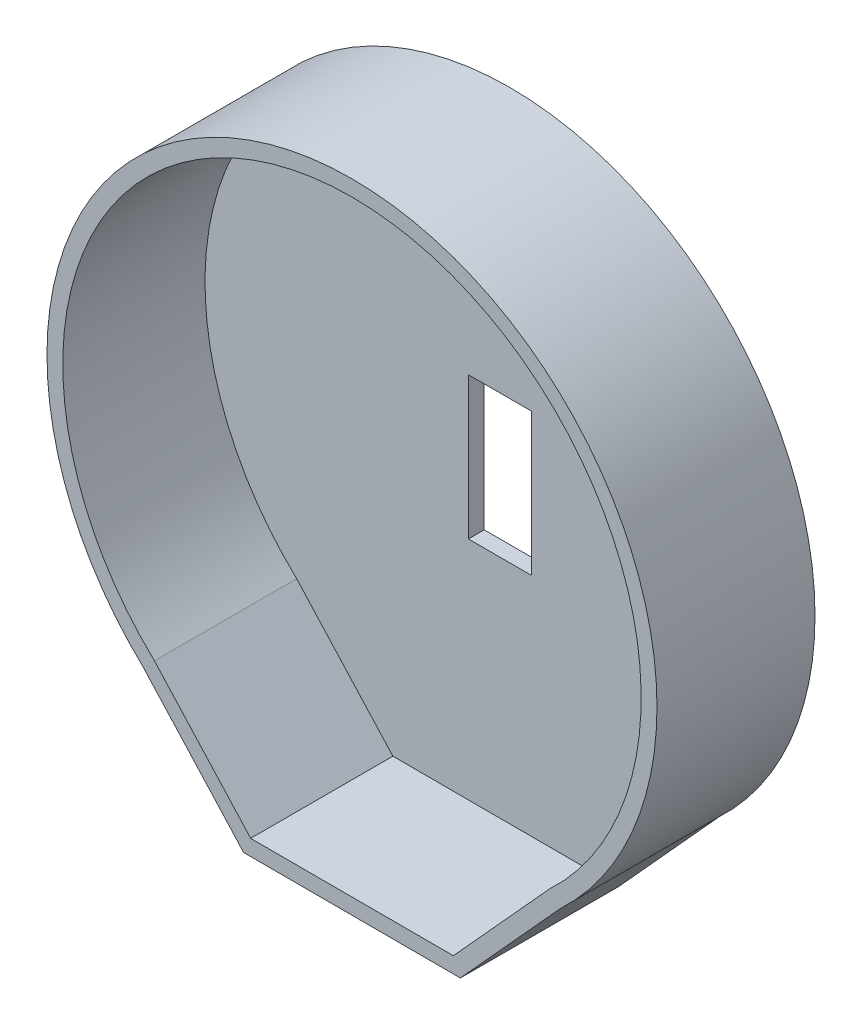
ISO-10303-21;
HEADER;
FILE_DESCRIPTION(('STEP AP214'),'2;1');
FILE_NAME('part.step','',(''),(''),'','','');
FILE_SCHEMA(('AUTOMOTIVE_DESIGN { 1 0 10303 214 1 1 1 1 }'));
ENDSEC;
DATA;
#1=APPLICATION_CONTEXT('core data for automotive mechanical design processes');
#2=APPLICATION_PROTOCOL_DEFINITION('international standard','automotive_design',2000,#1);
#3=PRODUCT_CONTEXT('',#1,'mechanical');
#4=PRODUCT('Part','Part','',(#3));
#5=PRODUCT_RELATED_PRODUCT_CATEGORY('part','',(#4));
#6=PRODUCT_DEFINITION_FORMATION('','',#4);
#7=PRODUCT_DEFINITION_CONTEXT('part definition',#1,'design');
#8=PRODUCT_DEFINITION('design','',#6,#7);
#9=PRODUCT_DEFINITION_SHAPE('','',#8);
#10=(LENGTH_UNIT() NAMED_UNIT(*) SI_UNIT(.MILLI.,.METRE.));
#11=(NAMED_UNIT(*) PLANE_ANGLE_UNIT() SI_UNIT($,.RADIAN.));
#12=(NAMED_UNIT(*) SI_UNIT($,.STERADIAN.) SOLID_ANGLE_UNIT());
#13=UNCERTAINTY_MEASURE_WITH_UNIT(LENGTH_MEASURE(1.E-05),#10,'distance_accuracy_value','');
#14=(GEOMETRIC_REPRESENTATION_CONTEXT(3) GLOBAL_UNCERTAINTY_ASSIGNED_CONTEXT((#13)) GLOBAL_UNIT_ASSIGNED_CONTEXT((#10,
#11,#12)) REPRESENTATION_CONTEXT('',''));
#15=CARTESIAN_POINT('',(0.,0.,0.));
#16=DIRECTION('',(0.,0.,1.));
#17=DIRECTION('',(1.,0.,0.));
#18=AXIS2_PLACEMENT_3D('',#15,#16,#17);
#19=CARTESIAN_POINT('',(-3.59774024797865,-21.8435557966853,10.));
#20=DIRECTION('',(-0.740412562536273,0.672152688931964,0.));
#21=DIRECTION('',(-0.672152688931964,-0.740412562536273,0.));
#22=AXIS2_PLACEMENT_3D('',#19,#20,#21);
#23=PLANE('',#22);
#24=DIRECTION('',(0.672152688931964,0.740412562536273,0.));
#25=VECTOR('',#24,1.);
#26=CARTESIAN_POINT('',(-3.59774024797865,-21.8435557966853,0.));
#27=LINE('',#26,#25);
#28=CARTESIAN_POINT('',(-3.59774024797865,-21.8435557966853,0.));
#29=VERTEX_POINT('',#28);
#30=CARTESIAN_POINT('',(2.75790810704578,-14.8424651775278,0.));
#31=VERTEX_POINT('',#30);
#32=EDGE_CURVE('E188',#29,#31,#27,.T.);
#33=ORIENTED_EDGE('',*,*,#32,.T.);
#34=DIRECTION('',(0.,0.,-1.));
#35=VECTOR('',#34,1.);
#36=CARTESIAN_POINT('',(2.75790810704578,-14.8424651775278,10.));
#37=LINE('',#36,#35);
#38=CARTESIAN_POINT('',(2.75790810704578,-14.8424651775278,10.));
#39=VERTEX_POINT('',#38);
#40=EDGE_CURVE('E11',#39,#31,#37,.T.);
#41=ORIENTED_EDGE('',*,*,#40,.F.);
#42=DIRECTION('',(0.672152688931964,0.740412562536273,0.));
#43=VECTOR('',#42,1.);
#44=CARTESIAN_POINT('',(-3.59774024797865,-21.8435557966853,10.));
#45=LINE('',#44,#43);
#46=CARTESIAN_POINT('',(-3.59774024797865,-21.8435557966853,10.));
#47=VERTEX_POINT('',#46);
#48=EDGE_CURVE('E222',#47,#39,#45,.T.);
#49=ORIENTED_EDGE('',*,*,#48,.F.);
#50=DIRECTION('',(0.,0.,-1.));
#51=VECTOR('',#50,1.);
#52=CARTESIAN_POINT('',(-3.59774024797865,-21.8435557966853,10.));
#53=LINE('',#52,#51);
#54=EDGE_CURVE('E237',#47,#29,#53,.T.);
#55=ORIENTED_EDGE('',*,*,#54,.T.);
#56=EDGE_LOOP('',(#33,#41,#49,#55));
#57=FACE_BOUND('',#56,.T.);
#58=ADVANCED_FACE('F43',(#57),#23,.F.);
#59=CARTESIAN_POINT('',(-10.4551158286561,-0.774558493355795,10.));
#60=DIRECTION('',(0.,0.,-1.));
#61=DIRECTION('',(-1.,0.,0.));
#62=AXIS2_PLACEMENT_3D('',#59,#60,#61);
#63=CYLINDRICAL_SURFACE('',#62,19.3);
#64=CARTESIAN_POINT('',(-10.4551158286561,-0.774558493355795,0.));
#65=DIRECTION('',(0.,0.,1.));
#66=DIRECTION('',(1.,0.,0.));
#67=AXIS2_PLACEMENT_3D('',#64,#65,#66);
#68=CIRCLE('',#67,19.3);
#69=CARTESIAN_POINT('',(-23.6681397643578,-14.8424651775278,0.));
#70=VERTEX_POINT('',#69);
#71=EDGE_CURVE('E241',#31,#70,#68,.T.);
#72=ORIENTED_EDGE('',*,*,#71,.T.);
#73=DIRECTION('',(0.,0.,-1.));
#74=VECTOR('',#73,1.);
#75=CARTESIAN_POINT('',(-23.6681397643578,-14.8424651775278,10.));
#76=LINE('',#75,#74);
#77=CARTESIAN_POINT('',(-23.6681397643578,-14.8424651775278,10.));
#78=VERTEX_POINT('',#77);
#79=EDGE_CURVE('E51',#78,#70,#76,.T.);
#80=ORIENTED_EDGE('',*,*,#79,.F.);
#81=CARTESIAN_POINT('',(-10.4551158286561,-0.774558493355795,10.));
#82=DIRECTION('',(0.,0.,1.));
#83=DIRECTION('',(1.,0.,0.));
#84=AXIS2_PLACEMENT_3D('',#81,#82,#83);
#85=CIRCLE('',#84,19.3);
#86=EDGE_CURVE('E226',#39,#78,#85,.T.);
#87=ORIENTED_EDGE('',*,*,#86,.F.);
#88=ORIENTED_EDGE('',*,*,#40,.T.);
#89=EDGE_LOOP('',(#72,#80,#87,#88));
#90=FACE_BOUND('',#89,.T.);
#91=ADVANCED_FACE('F263',(#90),#63,.T.);
#92=CARTESIAN_POINT('',(-17.3105207108081,-21.8238893763412,10.));
#93=DIRECTION('',(-0.739366827981317,-0.673302824649389,0.));
#94=DIRECTION('',(0.673302824649389,-0.739366827981317,0.));
#95=AXIS2_PLACEMENT_3D('',#92,#93,#94);
#96=PLANE('',#95);
#97=DIRECTION('',(-0.673302824649389,0.739366827981317,0.));
#98=VECTOR('',#97,1.);
#99=CARTESIAN_POINT('',(-17.3105207108081,-21.8238893763412,0.));
#100=LINE('',#99,#98);
#101=CARTESIAN_POINT('',(-17.3105207108081,-21.8238893763412,0.));
#102=VERTEX_POINT('',#101);
#103=EDGE_CURVE('E245',#102,#70,#100,.T.);
#104=ORIENTED_EDGE('',*,*,#103,.F.);
#105=DIRECTION('',(0.,0.,-1.));
#106=VECTOR('',#105,1.);
#107=CARTESIAN_POINT('',(-17.3105207108081,-21.8238893763412,10.));
#108=LINE('',#107,#106);
#109=CARTESIAN_POINT('',(-17.3105207108081,-21.8238893763412,10.));
#110=VERTEX_POINT('',#109);
#111=EDGE_CURVE('E254',#110,#102,#108,.T.);
#112=ORIENTED_EDGE('',*,*,#111,.F.);
#113=DIRECTION('',(-0.673302824649389,0.739366827981317,0.));
#114=VECTOR('',#113,1.);
#115=CARTESIAN_POINT('',(-17.3105207108081,-21.8238893763412,10.));
#116=LINE('',#115,#114);
#117=EDGE_CURVE('E230',#110,#78,#116,.T.);
#118=ORIENTED_EDGE('',*,*,#117,.T.);
#119=ORIENTED_EDGE('',*,*,#79,.T.);
#120=EDGE_LOOP('',(#104,#112,#118,#119));
#121=FACE_BOUND('',#120,.T.);
#122=ADVANCED_FACE('F260',(#121),#96,.T.);
#123=CARTESIAN_POINT('',(-17.3105207108081,-21.8238893763412,10.));
#124=DIRECTION('',(0.00143416575304298,0.999998971583768,0.));
#125=DIRECTION('',(-0.999998971583768,0.00143416575304298,0.));
#126=AXIS2_PLACEMENT_3D('',#123,#124,#125);
#127=PLANE('',#126);
#128=DIRECTION('',(0.999998971583767,-0.00143416575304298,0.));
#129=VECTOR('',#128,1.);
#130=CARTESIAN_POINT('',(-17.3105207108081,-21.8238893763412,0.));
#131=LINE('',#130,#129);
#132=EDGE_CURVE('E227',#102,#29,#131,.T.);
#133=ORIENTED_EDGE('',*,*,#132,.T.);
#134=ORIENTED_EDGE('',*,*,#54,.F.);
#135=DIRECTION('',(0.999998971583767,-0.00143416575304298,0.));
#136=VECTOR('',#135,1.);
#137=CARTESIAN_POINT('',(-17.3105207108081,-21.8238893763412,10.));
#138=LINE('',#137,#136);
#139=EDGE_CURVE('E234',#110,#47,#138,.T.);
#140=ORIENTED_EDGE('',*,*,#139,.F.);
#141=ORIENTED_EDGE('',*,*,#111,.T.);
#142=EDGE_LOOP('',(#133,#134,#140,#141));
#143=FACE_BOUND('',#142,.T.);
#144=ADVANCED_FACE('F271',(#143),#127,.F.);
#145=CARTESIAN_POINT('',(-10.4551158286561,-0.774558493355795,10.));
#146=DIRECTION('',(0.,0.,1.));
#147=DIRECTION('',(1.,0.,0.));
#148=AXIS2_PLACEMENT_3D('',#145,#146,#147);
#149=PLANE('',#148);
#150=DIRECTION('',(0.672152688931964,0.740412562536273,0.));
#151=VECTOR('',#150,1.);
#152=CARTESIAN_POINT('',(-4.33815281051492,-21.1714031077533,10.));
#153=LINE('',#152,#151);
#154=CARTESIAN_POINT('',(-4.03995361903653,-20.8429205603435,10.));
#155=VERTEX_POINT('',#154);
#156=CARTESIAN_POINT('',(2.04462195345001,-14.140431281116,10.));
#157=VERTEX_POINT('',#156);
#158=EDGE_CURVE('E210',#155,#157,#153,.T.);
#159=ORIENTED_EDGE('',*,*,#158,.F.);
#160=DIRECTION('',(0.999998971583768,-0.00143416575304298,0.));
#161=VECTOR('',#160,1.);
#162=CARTESIAN_POINT('',(-17.309086545055,-20.8238904047575,10.));
#163=LINE('',#162,#161);
#164=CARTESIAN_POINT('',(-16.8680830721684,-20.8245228774857,10.));
#165=VERTEX_POINT('',#164);
#166=EDGE_CURVE('E195',#165,#155,#163,.T.);
#167=ORIENTED_EDGE('',*,*,#166,.F.);
#168=DIRECTION('',(-0.673302824649389,0.739366827981317,0.));
#169=VECTOR('',#168,1.);
#170=CARTESIAN_POINT('',(-16.5711538828268,-21.1505865516919,10.));
#171=LINE('',#170,#169);
#172=CARTESIAN_POINT('',(-22.9554146294134,-14.1399065955111,10.));
#173=VERTEX_POINT('',#172);
#174=EDGE_CURVE('E216',#165,#173,#171,.T.);
#175=ORIENTED_EDGE('',*,*,#174,.T.);
#176=CARTESIAN_POINT('',(-10.4551158286561,-0.774558493355795,10.));
#177=DIRECTION('',(0.,0.,1.));
#178=DIRECTION('',(1.,0.,0.));
#179=AXIS2_PLACEMENT_3D('',#176,#177,#178);
#180=CIRCLE('',#179,18.3);
#181=EDGE_CURVE('E213',#157,#173,#180,.T.);
#182=ORIENTED_EDGE('',*,*,#181,.F.);
#183=EDGE_LOOP('',(#159,#167,#175,#182));
#184=FACE_BOUND('',#183,.T.);
#185=ORIENTED_EDGE('',*,*,#48,.T.);
#186=ORIENTED_EDGE('',*,*,#86,.T.);
#187=ORIENTED_EDGE('',*,*,#117,.F.);
#188=ORIENTED_EDGE('',*,*,#139,.T.);
#189=EDGE_LOOP('',(#185,#186,#187,#188));
#190=FACE_BOUND('',#189,.T.);
#191=ADVANCED_FACE('F276',(#184,#190),#149,.T.);
#192=CARTESIAN_POINT('',(-10.4551158286561,-0.774558493355795,0.));
#193=DIRECTION('',(0.,0.,1.));
#194=DIRECTION('',(1.,0.,0.));
#195=AXIS2_PLACEMENT_3D('',#192,#193,#194);
#196=PLANE('',#195);
#197=DIRECTION('',(-1.,0.,0.));
#198=VECTOR('',#197,1.);
#199=CARTESIAN_POINT('',(-12.0904733749358,-6.52951473626536,0.));
#200=LINE('',#199,#198);
#201=CARTESIAN_POINT('',(-8.09047337493576,-6.52951473626536,0.));
#202=VERTEX_POINT('',#201);
#203=CARTESIAN_POINT('',(-12.0904733749358,-6.52951473626536,0.));
#204=VERTEX_POINT('',#203);
#205=EDGE_CURVE('E162',#202,#204,#200,.T.);
#206=ORIENTED_EDGE('',*,*,#205,.F.);
#207=DIRECTION('',(0.,-1.,0.));
#208=VECTOR('',#207,1.);
#209=CARTESIAN_POINT('',(-8.09047337493576,2.47048526373464,0.));
#210=LINE('',#209,#208);
#211=CARTESIAN_POINT('',(-8.09047337493576,2.47048526373464,0.));
#212=VERTEX_POINT('',#211);
#213=EDGE_CURVE('E166',#212,#202,#210,.T.);
#214=ORIENTED_EDGE('',*,*,#213,.F.);
#215=DIRECTION('',(1.,0.,0.));
#216=VECTOR('',#215,1.);
#217=CARTESIAN_POINT('',(-12.0904733749358,2.47048526373464,0.));
#218=LINE('',#217,#216);
#219=CARTESIAN_POINT('',(-12.0904733749358,2.47048526373464,0.));
#220=VERTEX_POINT('',#219);
#221=EDGE_CURVE('E139',#220,#212,#218,.T.);
#222=ORIENTED_EDGE('',*,*,#221,.F.);
#223=DIRECTION('',(0.,1.,0.));
#224=VECTOR('',#223,1.);
#225=CARTESIAN_POINT('',(-12.0904733749358,2.47048526373464,0.));
#226=LINE('',#225,#224);
#227=EDGE_CURVE('E58',#204,#220,#226,.T.);
#228=ORIENTED_EDGE('',*,*,#227,.F.);
#229=EDGE_LOOP('',(#206,#214,#222,#228));
#230=FACE_BOUND('',#229,.T.);
#231=ORIENTED_EDGE('',*,*,#32,.F.);
#232=ORIENTED_EDGE('',*,*,#132,.F.);
#233=ORIENTED_EDGE('',*,*,#103,.T.);
#234=ORIENTED_EDGE('',*,*,#71,.F.);
#235=EDGE_LOOP('',(#231,#232,#233,#234));
#236=FACE_BOUND('',#235,.T.);
#237=ADVANCED_FACE('F268',(#230,#236),#196,.F.);
#238=CARTESIAN_POINT('',(-4.33815281051492,-21.1714031077533,10.));
#239=DIRECTION('',(-0.740412562536273,0.672152688931964,0.));
#240=DIRECTION('',(-0.672152688931964,-0.740412562536273,0.));
#241=AXIS2_PLACEMENT_3D('',#238,#239,#240);
#242=PLANE('',#241);
#243=DIRECTION('',(0.672152688931964,0.740412562536273,0.));
#244=VECTOR('',#243,1.);
#245=CARTESIAN_POINT('',(-4.33815281051492,-21.1714031077533,0.999999999999999));
#246=LINE('',#245,#244);
#247=CARTESIAN_POINT('',(-4.03995361903653,-20.8429205603435,1.));
#248=VERTEX_POINT('',#247);
#249=CARTESIAN_POINT('',(2.04462195345001,-14.140431281116,1.));
#250=VERTEX_POINT('',#249);
#251=EDGE_CURVE('E179',#248,#250,#246,.T.);
#252=ORIENTED_EDGE('',*,*,#251,.F.);
#253=DIRECTION('',(0.,0.,-1.));
#254=VECTOR('',#253,1.);
#255=CARTESIAN_POINT('',(-4.03995361903653,-20.8429205603435,10.));
#256=LINE('',#255,#254);
#257=EDGE_CURVE('E190',#155,#248,#256,.T.);
#258=ORIENTED_EDGE('',*,*,#257,.F.);
#259=ORIENTED_EDGE('',*,*,#158,.T.);
#260=DIRECTION('',(0.,0.,-1.));
#261=VECTOR('',#260,1.);
#262=CARTESIAN_POINT('',(2.04462195345001,-14.140431281116,10.));
#263=LINE('',#262,#261);
#264=EDGE_CURVE('E184',#157,#250,#263,.T.);
#265=ORIENTED_EDGE('',*,*,#264,.T.);
#266=EDGE_LOOP('',(#252,#258,#259,#265));
#267=FACE_BOUND('',#266,.T.);
#268=ADVANCED_FACE('F284',(#267),#242,.T.);
#269=CARTESIAN_POINT('',(-10.4551158286561,-0.774558493355795,10.));
#270=DIRECTION('',(0.,0.,-1.));
#271=DIRECTION('',(-1.,0.,0.));
#272=AXIS2_PLACEMENT_3D('',#269,#270,#271);
#273=CYLINDRICAL_SURFACE('',#272,18.3);
#274=CARTESIAN_POINT('',(-10.4551158286561,-0.774558493355795,0.999999999999999));
#275=DIRECTION('',(0.,0.,1.));
#276=DIRECTION('',(1.,0.,0.));
#277=AXIS2_PLACEMENT_3D('',#274,#275,#276);
#278=CIRCLE('',#277,18.3);
#279=CARTESIAN_POINT('',(-22.9554146294134,-14.1399065955111,1.));
#280=VERTEX_POINT('',#279);
#281=EDGE_CURVE('E183',#250,#280,#278,.T.);
#282=ORIENTED_EDGE('',*,*,#281,.F.);
#283=ORIENTED_EDGE('',*,*,#264,.F.);
#284=ORIENTED_EDGE('',*,*,#181,.T.);
#285=DIRECTION('',(0.,0.,-1.));
#286=VECTOR('',#285,1.);
#287=CARTESIAN_POINT('',(-22.9554146294134,-14.1399065955111,10.));
#288=LINE('',#287,#286);
#289=EDGE_CURVE('E189',#173,#280,#288,.T.);
#290=ORIENTED_EDGE('',*,*,#289,.T.);
#291=EDGE_LOOP('',(#282,#283,#284,#290));
#292=FACE_BOUND('',#291,.T.);
#293=ADVANCED_FACE('F320',(#292),#273,.F.);
#294=CARTESIAN_POINT('',(-16.5711538828268,-21.1505865516919,10.));
#295=DIRECTION('',(-0.739366827981317,-0.673302824649389,0.));
#296=DIRECTION('',(0.673302824649389,-0.739366827981317,0.));
#297=AXIS2_PLACEMENT_3D('',#294,#295,#296);
#298=PLANE('',#297);
#299=DIRECTION('',(-0.673302824649389,0.739366827981317,0.));
#300=VECTOR('',#299,1.);
#301=CARTESIAN_POINT('',(-16.5711538828268,-21.1505865516919,0.999999999999999));
#302=LINE('',#301,#300);
#303=CARTESIAN_POINT('',(-16.8680830721684,-20.8245228774857,1.));
#304=VERTEX_POINT('',#303);
#305=EDGE_CURVE('E199',#304,#280,#302,.T.);
#306=ORIENTED_EDGE('',*,*,#305,.T.);
#307=ORIENTED_EDGE('',*,*,#289,.F.);
#308=ORIENTED_EDGE('',*,*,#174,.F.);
#309=DIRECTION('',(0.,0.,-1.));
#310=VECTOR('',#309,1.);
#311=CARTESIAN_POINT('',(-16.8680830721684,-20.8245228774857,10.));
#312=LINE('',#311,#310);
#313=EDGE_CURVE('E194',#165,#304,#312,.T.);
#314=ORIENTED_EDGE('',*,*,#313,.T.);
#315=EDGE_LOOP('',(#306,#307,#308,#314));
#316=FACE_BOUND('',#315,.T.);
#317=ADVANCED_FACE('F331',(#316),#298,.F.);
#318=CARTESIAN_POINT('',(-17.309086545055,-20.8238904047575,10.));
#319=DIRECTION('',(0.00143416575304298,0.999998971583768,0.));
#320=DIRECTION('',(-0.999998971583768,0.00143416575304298,0.));
#321=AXIS2_PLACEMENT_3D('',#318,#319,#320);
#322=PLANE('',#321);
#323=DIRECTION('',(0.999998971583768,-0.00143416575304298,0.));
#324=VECTOR('',#323,1.);
#325=CARTESIAN_POINT('',(-17.309086545055,-20.8238904047575,0.999999999999999));
#326=LINE('',#325,#324);
#327=EDGE_CURVE('E205',#304,#248,#326,.T.);
#328=ORIENTED_EDGE('',*,*,#327,.F.);
#329=ORIENTED_EDGE('',*,*,#313,.F.);
#330=ORIENTED_EDGE('',*,*,#166,.T.);
#331=ORIENTED_EDGE('',*,*,#257,.T.);
#332=EDGE_LOOP('',(#328,#329,#330,#331));
#333=FACE_BOUND('',#332,.T.);
#334=ADVANCED_FACE('F342',(#333),#322,.T.);
#335=CARTESIAN_POINT('',(-10.4551158286561,-0.774558493355795,1.));
#336=DIRECTION('',(0.,0.,1.));
#337=DIRECTION('',(1.,0.,0.));
#338=AXIS2_PLACEMENT_3D('',#335,#336,#337);
#339=PLANE('',#338);
#340=DIRECTION('',(0.,-1.,0.));
#341=VECTOR('',#340,1.);
#342=CARTESIAN_POINT('',(-8.09047337493576,2.47048526373464,1.));
#343=LINE('',#342,#341);
#344=CARTESIAN_POINT('',(-8.09047337493576,2.47048526373464,1.));
#345=VERTEX_POINT('',#344);
#346=CARTESIAN_POINT('',(-8.09047337493576,-6.52951473626536,1.));
#347=VERTEX_POINT('',#346);
#348=EDGE_CURVE('E155',#345,#347,#343,.T.);
#349=ORIENTED_EDGE('',*,*,#348,.T.);
#350=DIRECTION('',(-1.,0.,0.));
#351=VECTOR('',#350,1.);
#352=CARTESIAN_POINT('',(-12.0904733749358,-6.52951473626536,1.));
#353=LINE('',#352,#351);
#354=CARTESIAN_POINT('',(-12.0904733749358,-6.52951473626536,1.));
#355=VERTEX_POINT('',#354);
#356=EDGE_CURVE('E151',#347,#355,#353,.T.);
#357=ORIENTED_EDGE('',*,*,#356,.T.);
#358=DIRECTION('',(0.,1.,0.));
#359=VECTOR('',#358,1.);
#360=CARTESIAN_POINT('',(-12.0904733749358,2.47048526373464,1.));
#361=LINE('',#360,#359);
#362=CARTESIAN_POINT('',(-12.0904733749358,2.47048526373464,1.));
#363=VERTEX_POINT('',#362);
#364=EDGE_CURVE('E143',#355,#363,#361,.T.);
#365=ORIENTED_EDGE('',*,*,#364,.T.);
#366=DIRECTION('',(1.,0.,0.));
#367=VECTOR('',#366,1.);
#368=CARTESIAN_POINT('',(-12.0904733749358,2.47048526373464,1.));
#369=LINE('',#368,#367);
#370=EDGE_CURVE('E131',#363,#345,#369,.T.);
#371=ORIENTED_EDGE('',*,*,#370,.T.);
#372=EDGE_LOOP('',(#349,#357,#365,#371));
#373=FACE_BOUND('',#372,.T.);
#374=ORIENTED_EDGE('',*,*,#251,.T.);
#375=ORIENTED_EDGE('',*,*,#281,.T.);
#376=ORIENTED_EDGE('',*,*,#305,.F.);
#377=ORIENTED_EDGE('',*,*,#327,.T.);
#378=EDGE_LOOP('',(#374,#375,#376,#377));
#379=FACE_BOUND('',#378,.T.);
#380=ADVANCED_FACE('F149',(#373,#379),#339,.T.);
#381=CARTESIAN_POINT('',(-8.09047337493576,2.47048526373464,-0.000999999999999265));
#382=DIRECTION('',(1.,0.,0.));
#383=DIRECTION('',(0.,0.,-1.));
#384=AXIS2_PLACEMENT_3D('',#381,#382,#383);
#385=PLANE('',#384);
#386=ORIENTED_EDGE('',*,*,#213,.T.);
#387=DIRECTION('',(0.,0.,1.));
#388=VECTOR('',#387,1.);
#389=CARTESIAN_POINT('',(-8.09047337493576,-6.52951473626536,-0.000999999999999265));
#390=LINE('',#389,#388);
#391=EDGE_CURVE('E140',#202,#347,#390,.T.);
#392=ORIENTED_EDGE('',*,*,#391,.T.);
#393=ORIENTED_EDGE('',*,*,#348,.F.);
#394=DIRECTION('',(0.,0.,1.));
#395=VECTOR('',#394,1.);
#396=CARTESIAN_POINT('',(-8.09047337493576,2.47048526373464,-0.000999999999999265));
#397=LINE('',#396,#395);
#398=EDGE_CURVE('E66',#212,#345,#397,.T.);
#399=ORIENTED_EDGE('',*,*,#398,.F.);
#400=EDGE_LOOP('',(#386,#392,#393,#399));
#401=FACE_BOUND('',#400,.T.);
#402=ADVANCED_FACE('F369',(#401),#385,.F.);
#403=CARTESIAN_POINT('',(-12.0904733749358,-6.52951473626536,-0.000999999999999265));
#404=DIRECTION('',(0.,-1.,0.));
#405=DIRECTION('',(0.,0.,-1.));
#406=AXIS2_PLACEMENT_3D('',#403,#404,#405);
#407=PLANE('',#406);
#408=ORIENTED_EDGE('',*,*,#205,.T.);
#409=DIRECTION('',(0.,0.,1.));
#410=VECTOR('',#409,1.);
#411=CARTESIAN_POINT('',(-12.0904733749358,-6.52951473626536,-0.000999999999999265));
#412=LINE('',#411,#410);
#413=EDGE_CURVE('E146',#204,#355,#412,.T.);
#414=ORIENTED_EDGE('',*,*,#413,.T.);
#415=ORIENTED_EDGE('',*,*,#356,.F.);
#416=ORIENTED_EDGE('',*,*,#391,.F.);
#417=EDGE_LOOP('',(#408,#414,#415,#416));
#418=FACE_BOUND('',#417,.T.);
#419=ADVANCED_FACE('F378',(#418),#407,.F.);
#420=CARTESIAN_POINT('',(-12.0904733749358,2.47048526373464,-0.000999999999999265));
#421=DIRECTION('',(-1.,0.,0.));
#422=DIRECTION('',(0.,-1.,0.));
#423=AXIS2_PLACEMENT_3D('',#420,#421,#422);
#424=PLANE('',#423);
#425=ORIENTED_EDGE('',*,*,#227,.T.);
#426=DIRECTION('',(0.,0.,1.));
#427=VECTOR('',#426,1.);
#428=CARTESIAN_POINT('',(-12.0904733749358,2.47048526373464,-0.000999999999999265));
#429=LINE('',#428,#427);
#430=EDGE_CURVE('E133',#220,#363,#429,.T.);
#431=ORIENTED_EDGE('',*,*,#430,.T.);
#432=ORIENTED_EDGE('',*,*,#364,.F.);
#433=ORIENTED_EDGE('',*,*,#413,.F.);
#434=EDGE_LOOP('',(#425,#431,#432,#433));
#435=FACE_BOUND('',#434,.T.);
#436=ADVANCED_FACE('F142',(#435),#424,.F.);
#437=CARTESIAN_POINT('',(-12.0904733749358,2.47048526373464,-0.000999999999999265));
#438=DIRECTION('',(0.,1.,0.));
#439=DIRECTION('',(0.,0.,1.));
#440=AXIS2_PLACEMENT_3D('',#437,#438,#439);
#441=PLANE('',#440);
#442=ORIENTED_EDGE('',*,*,#221,.T.);
#443=ORIENTED_EDGE('',*,*,#398,.T.);
#444=ORIENTED_EDGE('',*,*,#370,.F.);
#445=ORIENTED_EDGE('',*,*,#430,.F.);
#446=EDGE_LOOP('',(#442,#443,#444,#445));
#447=FACE_BOUND('',#446,.T.);
#448=ADVANCED_FACE('F132',(#447),#441,.F.);
#449=CLOSED_SHELL('',(#58,#91,#122,#144,#191,#237,#268,#293,#317,#334,#380,#402,#419,#436,#448));
#450=MANIFOLD_SOLID_BREP('B2',#449);
#451=ADVANCED_BREP_SHAPE_REPRESENTATION('',(#18,#450),#14);
#452=SHAPE_DEFINITION_REPRESENTATION(#9,#451);
ENDSEC;
END-ISO-10303-21;
